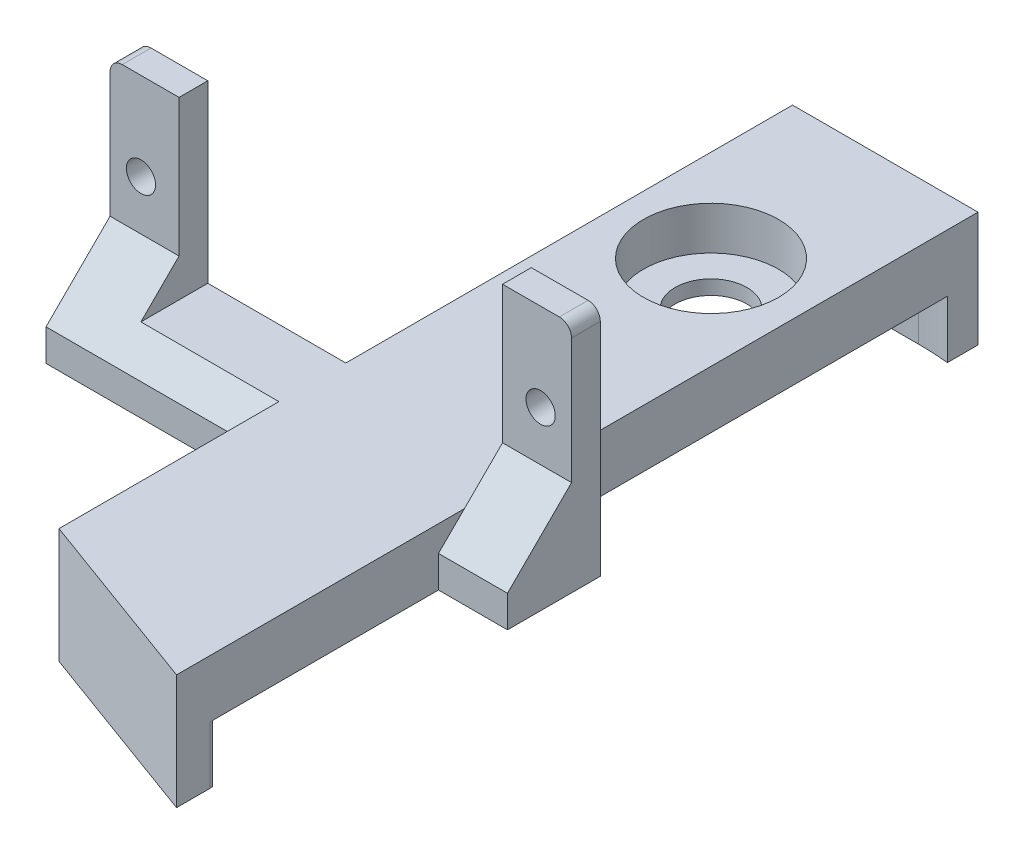
ISO-10303-21;
HEADER;
FILE_DESCRIPTION(('STEP AP214'),'2;1');
FILE_NAME('part.step','',(''),(''),'','','');
FILE_SCHEMA(('AUTOMOTIVE_DESIGN { 1 0 10303 214 1 1 1 1 }'));
ENDSEC;
DATA;
#1=APPLICATION_CONTEXT('core data for automotive mechanical design processes');
#2=APPLICATION_PROTOCOL_DEFINITION('international standard','automotive_design',2000,#1);
#3=PRODUCT_CONTEXT('',#1,'mechanical');
#4=PRODUCT('Part','Part','',(#3));
#5=PRODUCT_RELATED_PRODUCT_CATEGORY('part','',(#4));
#6=PRODUCT_DEFINITION_FORMATION('','',#4);
#7=PRODUCT_DEFINITION_CONTEXT('part definition',#1,'design');
#8=PRODUCT_DEFINITION('design','',#6,#7);
#9=PRODUCT_DEFINITION_SHAPE('','',#8);
#10=(LENGTH_UNIT() NAMED_UNIT(*) SI_UNIT(.MILLI.,.METRE.));
#11=(NAMED_UNIT(*) PLANE_ANGLE_UNIT() SI_UNIT($,.RADIAN.));
#12=(NAMED_UNIT(*) SI_UNIT($,.STERADIAN.) SOLID_ANGLE_UNIT());
#13=UNCERTAINTY_MEASURE_WITH_UNIT(LENGTH_MEASURE(1.E-05),#10,'distance_accuracy_value','');
#14=(GEOMETRIC_REPRESENTATION_CONTEXT(3) GLOBAL_UNCERTAINTY_ASSIGNED_CONTEXT((#13)) GLOBAL_UNIT_ASSIGNED_CONTEXT((#10,
#11,#12)) REPRESENTATION_CONTEXT('',''));
#15=CARTESIAN_POINT('',(0.,0.,0.));
#16=DIRECTION('',(0.,0.,1.));
#17=DIRECTION('',(1.,0.,0.));
#18=AXIS2_PLACEMENT_3D('',#15,#16,#17);
#19=CARTESIAN_POINT('',(24.0462381627888,-9.09999999999987,7.665828595555));
#20=DIRECTION('',(0.,-0.70856176119434,-0.705648801156195));
#21=DIRECTION('',(0.,0.705648801156195,-0.70856176119434));
#22=AXIS2_PLACEMENT_3D('',#19,#20,#21);
#23=PLANE('',#22);
#24=DIRECTION('',(-1.,0.,0.));
#25=VECTOR('',#24,1.);
#26=CARTESIAN_POINT('',(24.0462381627888,-7.89434521112556,6.45519679231599));
#27=LINE('',#26,#25);
#28=CARTESIAN_POINT('',(-1.64999999999999,-7.8943452111257,6.45519679231599));
#29=VERTEX_POINT('',#28);
#30=CARTESIAN_POINT('',(-16.05,-7.89434521112579,6.45519679231599));
#31=VERTEX_POINT('',#30);
#32=EDGE_CURVE('E249',#29,#31,#27,.T.);
#33=ORIENTED_EDGE('',*,*,#32,.F.);
#34=DIRECTION('',(0.,0.705648801156195,-0.70856176119434));
#35=VECTOR('',#34,1.);
#36=CARTESIAN_POINT('',(-1.65000000000002,-5.2671182257889,3.8171244584051));
#37=LINE('',#36,#35);
#38=CARTESIAN_POINT('',(-1.65000000000001,-6.10000000000001,4.65344441790159));
#39=VERTEX_POINT('',#38);
#40=EDGE_CURVE('E256',#29,#39,#37,.T.);
#41=ORIENTED_EDGE('',*,*,#40,.T.);
#42=DIRECTION('',(1.,0.,0.));
#43=VECTOR('',#42,1.);
#44=CARTESIAN_POINT('',(24.0462381627888,-6.09999999999987,4.65344441790159));
#45=LINE('',#44,#43);
#46=CARTESIAN_POINT('',(-11.25,-6.10000000000007,4.65344441790159));
#47=VERTEX_POINT('',#46);
#48=EDGE_CURVE('E435',#47,#39,#45,.T.);
#49=ORIENTED_EDGE('',*,*,#48,.F.);
#50=DIRECTION('',(0.,-0.705648801156195,0.70856176119434));
#51=VECTOR('',#50,1.);
#52=CARTESIAN_POINT('',(-11.25,-9.10000000000007,7.665828595555));
#53=LINE('',#52,#51);
#54=CARTESIAN_POINT('',(-11.25,-3.45746412666863,2.));
#55=VERTEX_POINT('',#54);
#56=EDGE_CURVE('E428',#55,#47,#53,.T.);
#57=ORIENTED_EDGE('',*,*,#56,.F.);
#58=DIRECTION('',(-1.,0.,0.));
#59=VECTOR('',#58,1.);
#60=CARTESIAN_POINT('',(24.0462381627887,-3.45746412666856,2.));
#61=LINE('',#60,#59);
#62=CARTESIAN_POINT('',(-16.05,-3.45746412666879,2.));
#63=VERTEX_POINT('',#62);
#64=EDGE_CURVE('E495',#55,#63,#61,.T.);
#65=ORIENTED_EDGE('',*,*,#64,.T.);
#66=DIRECTION('',(0.,0.705648801156195,-0.70856176119434));
#67=VECTOR('',#66,1.);
#68=CARTESIAN_POINT('',(-16.05,-9.10000000000012,7.66582859555502));
#69=LINE('',#68,#67);
#70=EDGE_CURVE('E493',#31,#63,#69,.T.);
#71=ORIENTED_EDGE('',*,*,#70,.F.);
#72=EDGE_LOOP('',(#33,#41,#49,#57,#65,#71));
#73=FACE_BOUND('',#72,.T.);
#74=ADVANCED_FACE('F37',(#73),#23,.F.);
#75=CARTESIAN_POINT('',(-16.05,0.,2.));
#76=DIRECTION('',(1.,0.,0.));
#77=DIRECTION('',(0.,1.,0.));
#78=AXIS2_PLACEMENT_3D('',#75,#76,#77);
#79=PLANE('',#78);
#80=DIRECTION('',(0.,1.,0.));
#81=VECTOR('',#80,1.);
#82=CARTESIAN_POINT('',(-16.05,-10.1000000000001,6.45519679231599));
#83=LINE('',#82,#81);
#84=CARTESIAN_POINT('',(-16.05,-10.1000000000001,6.45519679231599));
#85=VERTEX_POINT('',#84);
#86=EDGE_CURVE('E483',#85,#31,#83,.T.);
#87=ORIENTED_EDGE('',*,*,#86,.T.);
#88=ORIENTED_EDGE('',*,*,#70,.T.);
#89=DIRECTION('',(0.,-1.,0.));
#90=VECTOR('',#89,1.);
#91=CARTESIAN_POINT('',(-16.05,0.,2.));
#92=LINE('',#91,#90);
#93=CARTESIAN_POINT('',(-16.05,5.25,2.));
#94=VERTEX_POINT('',#93);
#95=EDGE_CURVE('E388',#94,#63,#92,.T.);
#96=ORIENTED_EDGE('',*,*,#95,.F.);
#97=DIRECTION('',(0.,0.,-1.));
#98=VECTOR('',#97,1.);
#99=CARTESIAN_POINT('',(-16.05,5.25,2.));
#100=LINE('',#99,#98);
#101=CARTESIAN_POINT('',(-16.05,5.25,0.));
#102=VERTEX_POINT('',#101);
#103=EDGE_CURVE('E398',#94,#102,#100,.T.);
#104=ORIENTED_EDGE('',*,*,#103,.T.);
#105=DIRECTION('',(0.,-1.,0.));
#106=VECTOR('',#105,1.);
#107=CARTESIAN_POINT('',(-16.05,0.,0.));
#108=LINE('',#107,#106);
#109=CARTESIAN_POINT('',(-16.05,-10.1000000000001,0.));
#110=VERTEX_POINT('',#109);
#111=EDGE_CURVE('E401',#102,#110,#108,.T.);
#112=ORIENTED_EDGE('',*,*,#111,.T.);
#113=DIRECTION('',(0.,0.,-1.));
#114=VECTOR('',#113,1.);
#115=CARTESIAN_POINT('',(-16.05,-10.1000000000001,6.45519679231599));
#116=LINE('',#115,#114);
#117=EDGE_CURVE('E451',#85,#110,#116,.T.);
#118=ORIENTED_EDGE('',*,*,#117,.F.);
#119=EDGE_LOOP('',(#87,#88,#96,#104,#112,#118));
#120=FACE_BOUND('',#119,.T.);
#121=ADVANCED_FACE('F582',(#120),#79,.F.);
#122=DIRECTION('',(0.,-0.705648801156195,0.70856176119434));
#123=VECTOR('',#122,1.);
#124=CARTESIAN_POINT('',(11.25,-5.26711822578882,3.8171244584051));
#125=LINE('',#124,#123);
#126=CARTESIAN_POINT('',(11.25,-6.09999999999994,4.65344441790159));
#127=VERTEX_POINT('',#126);
#128=CARTESIAN_POINT('',(11.25,-7.89434521112563,6.45519679231599));
#129=VERTEX_POINT('',#128);
#130=EDGE_CURVE('E233',#127,#129,#125,.T.);
#131=ORIENTED_EDGE('',*,*,#130,.T.);
#132=DIRECTION('',(1.,0.,0.));
#133=VECTOR('',#132,1.);
#134=CARTESIAN_POINT('',(24.0462381627888,-7.89434521112556,6.45519679231599));
#135=LINE('',#134,#133);
#136=CARTESIAN_POINT('',(16.05,-7.8943452111256,6.45519679231599));
#137=VERTEX_POINT('',#136);
#138=EDGE_CURVE('E243',#129,#137,#135,.T.);
#139=ORIENTED_EDGE('',*,*,#138,.T.);
#140=DIRECTION('',(0.,0.705648801156195,-0.70856176119434));
#141=VECTOR('',#140,1.);
#142=CARTESIAN_POINT('',(16.05,-9.09999999999991,7.665828595555));
#143=LINE('',#142,#141);
#144=CARTESIAN_POINT('',(16.05,-3.45746412666861,2.));
#145=VERTEX_POINT('',#144);
#146=EDGE_CURVE('E262',#137,#145,#143,.T.);
#147=ORIENTED_EDGE('',*,*,#146,.T.);
#148=CARTESIAN_POINT('',(11.25,-3.45746412666863,2.));
#149=VERTEX_POINT('',#148);
#150=EDGE_CURVE('E496',#145,#149,#61,.T.);
#151=ORIENTED_EDGE('',*,*,#150,.T.);
#152=DIRECTION('',(0.,0.705648801156195,-0.70856176119434));
#153=VECTOR('',#152,1.);
#154=CARTESIAN_POINT('',(11.25,-9.09999999999994,7.665828595555));
#155=LINE('',#154,#153);
#156=EDGE_CURVE('E254',#127,#149,#155,.T.);
#157=ORIENTED_EDGE('',*,*,#156,.F.);
#158=EDGE_LOOP('',(#131,#139,#147,#151,#157));
#159=FACE_BOUND('',#158,.T.);
#160=ADVANCED_FACE('F252',(#159),#23,.F.);
#161=CARTESIAN_POINT('',(0.,0.,2.));
#162=DIRECTION('',(0.,0.,1.));
#163=DIRECTION('',(1.,0.,0.));
#164=AXIS2_PLACEMENT_3D('',#161,#162,#163);
#165=PLANE('',#164);
#166=CARTESIAN_POINT('',(-13.9,0.,2.));
#167=DIRECTION('',(0.,0.,1.));
#168=DIRECTION('',(1.,0.,0.));
#169=AXIS2_PLACEMENT_3D('',#166,#167,#168);
#170=CIRCLE('',#169,1.016);
#171=CARTESIAN_POINT('',(-12.884,0.,2.));
#172=VERTEX_POINT('',#171);
#173=EDGE_CURVE('E385',#172,#172,#170,.T.);
#174=ORIENTED_EDGE('',*,*,#173,.F.);
#175=EDGE_LOOP('',(#174));
#176=FACE_BOUND('',#175,.T.);
#177=ORIENTED_EDGE('',*,*,#95,.T.);
#178=ORIENTED_EDGE('',*,*,#64,.F.);
#179=DIRECTION('',(0.,-1.,0.));
#180=VECTOR('',#179,1.);
#181=CARTESIAN_POINT('',(-11.25,0.,2.));
#182=LINE('',#181,#180);
#183=CARTESIAN_POINT('',(-11.25,6.1,2.));
#184=VERTEX_POINT('',#183);
#185=EDGE_CURVE('E392',#184,#55,#182,.T.);
#186=ORIENTED_EDGE('',*,*,#185,.F.);
#187=DIRECTION('',(-1.,0.,0.));
#188=VECTOR('',#187,1.);
#189=CARTESIAN_POINT('',(0.,6.1,2.));
#190=LINE('',#189,#188);
#191=CARTESIAN_POINT('',(-15.2,6.1,2.));
#192=VERTEX_POINT('',#191);
#193=EDGE_CURVE('E394',#184,#192,#190,.T.);
#194=ORIENTED_EDGE('',*,*,#193,.T.);
#195=CARTESIAN_POINT('',(-15.2,5.25,2.));
#196=DIRECTION('',(0.,0.,1.));
#197=DIRECTION('',(1.,0.,0.));
#198=AXIS2_PLACEMENT_3D('',#195,#196,#197);
#199=CIRCLE('',#198,0.850000000000002);
#200=EDGE_CURVE('E396',#192,#94,#199,.T.);
#201=ORIENTED_EDGE('',*,*,#200,.T.);
#202=EDGE_LOOP('',(#177,#178,#186,#194,#201));
#203=FACE_BOUND('',#202,.T.);
#204=ADVANCED_FACE('F589',(#176,#203),#165,.T.);
#205=CARTESIAN_POINT('',(0.,-9.1,2.));
#206=DIRECTION('',(0.,0.,-1.));
#207=DIRECTION('',(-1.,0.,0.));
#208=AXIS2_PLACEMENT_3D('',#205,#206,#207);
#209=PLANE('',#208);
#210=CARTESIAN_POINT('',(13.9,0.,2.));
#211=DIRECTION('',(0.,0.,1.));
#212=DIRECTION('',(1.,0.,0.));
#213=AXIS2_PLACEMENT_3D('',#210,#211,#212);
#214=CIRCLE('',#213,1.016);
#215=CARTESIAN_POINT('',(14.916,0.,2.));
#216=VERTEX_POINT('',#215);
#217=EDGE_CURVE('E313',#216,#216,#214,.T.);
#218=ORIENTED_EDGE('',*,*,#217,.F.);
#219=EDGE_LOOP('',(#218));
#220=FACE_BOUND('',#219,.T.);
#221=ORIENTED_EDGE('',*,*,#150,.F.);
#222=DIRECTION('',(0.,1.,0.));
#223=VECTOR('',#222,1.);
#224=CARTESIAN_POINT('',(16.05,-9.09999999999991,2.));
#225=LINE('',#224,#223);
#226=CARTESIAN_POINT('',(16.05,5.25,2.));
#227=VERTEX_POINT('',#226);
#228=EDGE_CURVE('E371',#145,#227,#225,.T.);
#229=ORIENTED_EDGE('',*,*,#228,.T.);
#230=CARTESIAN_POINT('',(15.2,5.25,2.));
#231=DIRECTION('',(0.,0.,1.));
#232=DIRECTION('',(1.,0.,0.));
#233=AXIS2_PLACEMENT_3D('',#230,#231,#232);
#234=CIRCLE('',#233,0.849999999999998);
#235=CARTESIAN_POINT('',(15.2,6.1,2.));
#236=VERTEX_POINT('',#235);
#237=EDGE_CURVE('E316',#227,#236,#234,.T.);
#238=ORIENTED_EDGE('',*,*,#237,.T.);
#239=DIRECTION('',(0.999998883397845,0.00149439053219066,0.));
#240=VECTOR('',#239,1.);
#241=CARTESIAN_POINT('',(-0.00908182738110785,6.07727166673534,2.));
#242=LINE('',#241,#240);
#243=CARTESIAN_POINT('',(11.25,6.09409715080671,2.));
#244=VERTEX_POINT('',#243);
#245=EDGE_CURVE('E319',#244,#236,#242,.T.);
#246=ORIENTED_EDGE('',*,*,#245,.F.);
#247=DIRECTION('',(0.,1.,0.));
#248=VECTOR('',#247,1.);
#249=CARTESIAN_POINT('',(11.25,0.,2.));
#250=LINE('',#249,#248);
#251=EDGE_CURVE('E322',#149,#244,#250,.T.);
#252=ORIENTED_EDGE('',*,*,#251,.F.);
#253=EDGE_LOOP('',(#221,#229,#238,#246,#252));
#254=FACE_BOUND('',#253,.T.);
#255=ADVANCED_FACE('F502',(#220,#254),#209,.F.);
#256=CARTESIAN_POINT('',(11.25,-9.09999999999994,0.));
#257=DIRECTION('',(-1.,0.,0.));
#258=DIRECTION('',(0.,-1.,0.));
#259=AXIS2_PLACEMENT_3D('',#256,#257,#258);
#260=PLANE('',#259);
#261=DIRECTION('',(0.,0.,1.));
#262=VECTOR('',#261,1.);
#263=CARTESIAN_POINT('',(11.25,-6.09999999999994,0.));
#264=LINE('',#263,#262);
#265=CARTESIAN_POINT('',(11.25,-6.09999999999994,24.6755929533757));
#266=VERTEX_POINT('',#265);
#267=EDGE_CURVE('E351',#127,#266,#264,.T.);
#268=ORIENTED_EDGE('',*,*,#267,.T.);
#269=DIRECTION('',(0.,1.,0.));
#270=VECTOR('',#269,1.);
#271=CARTESIAN_POINT('',(11.25,-9.09999999999994,24.6755929533757));
#272=LINE('',#271,#270);
#273=CARTESIAN_POINT('',(11.2500000000001,-14.0999999999999,24.6755929533757));
#274=VERTEX_POINT('',#273);
#275=EDGE_CURVE('E368',#274,#266,#272,.T.);
#276=ORIENTED_EDGE('',*,*,#275,.F.);
#277=DIRECTION('',(0.,0.,1.));
#278=VECTOR('',#277,1.);
#279=CARTESIAN_POINT('',(11.2500000000001,-14.0999999999999,0.));
#280=LINE('',#279,#278);
#281=CARTESIAN_POINT('',(11.2500000000001,-14.0999999999999,22.3410960151975));
#282=VERTEX_POINT('',#281);
#283=EDGE_CURVE('E296',#282,#274,#280,.T.);
#284=ORIENTED_EDGE('',*,*,#283,.F.);
#285=DIRECTION('',(0.,1.,0.));
#286=VECTOR('',#285,1.);
#287=CARTESIAN_POINT('',(11.2500000000001,-14.0999999999999,22.3410960151975));
#288=LINE('',#287,#286);
#289=CARTESIAN_POINT('',(11.25,-10.0999999999999,22.3410960151975));
#290=VERTEX_POINT('',#289);
#291=EDGE_CURVE('E305',#282,#290,#288,.T.);
#292=ORIENTED_EDGE('',*,*,#291,.T.);
#293=DIRECTION('',(0.,0.,1.));
#294=VECTOR('',#293,1.);
#295=CARTESIAN_POINT('',(11.25,-10.0999999999999,6.45519679231599));
#296=LINE('',#295,#294);
#297=CARTESIAN_POINT('',(11.25,-10.0999999999999,6.45519679231599));
#298=VERTEX_POINT('',#297);
#299=EDGE_CURVE('E236',#298,#290,#296,.T.);
#300=ORIENTED_EDGE('',*,*,#299,.F.);
#301=DIRECTION('',(0.,1.,0.));
#302=VECTOR('',#301,1.);
#303=CARTESIAN_POINT('',(11.25,-10.0999999999999,6.45519679231599));
#304=LINE('',#303,#302);
#305=EDGE_CURVE('E229',#298,#129,#304,.T.);
#306=ORIENTED_EDGE('',*,*,#305,.T.);
#307=ORIENTED_EDGE('',*,*,#130,.F.);
#308=EDGE_LOOP('',(#268,#276,#284,#292,#300,#306,#307));
#309=FACE_BOUND('',#308,.T.);
#310=ADVANCED_FACE('F231',(#309),#260,.F.);
#311=CARTESIAN_POINT('',(-1.65,-9.10000000000001,0.));
#312=DIRECTION('',(1.,0.,0.));
#313=DIRECTION('',(0.,1.,0.));
#314=AXIS2_PLACEMENT_3D('',#311,#312,#313);
#315=PLANE('',#314);
#316=ORIENTED_EDGE('',*,*,#40,.F.);
#317=DIRECTION('',(0.,1.,0.));
#318=VECTOR('',#317,1.);
#319=CARTESIAN_POINT('',(-1.65,-10.1,6.45519679231599));
#320=LINE('',#319,#318);
#321=CARTESIAN_POINT('',(-1.65,-10.1,6.45519679231599));
#322=VERTEX_POINT('',#321);
#323=EDGE_CURVE('E485',#322,#29,#320,.T.);
#324=ORIENTED_EDGE('',*,*,#323,.F.);
#325=DIRECTION('',(0.,0.,-1.));
#326=VECTOR('',#325,1.);
#327=CARTESIAN_POINT('',(-1.65,-10.1,16.4387700103624));
#328=LINE('',#327,#326);
#329=CARTESIAN_POINT('',(-1.65,-10.1,16.4387700103624));
#330=VERTEX_POINT('',#329);
#331=EDGE_CURVE('E564',#330,#322,#328,.T.);
#332=ORIENTED_EDGE('',*,*,#331,.F.);
#333=DIRECTION('',(0.,1.,0.));
#334=VECTOR('',#333,1.);
#335=CARTESIAN_POINT('',(-1.64999999999997,-14.1,16.4387700103624));
#336=LINE('',#335,#334);
#337=CARTESIAN_POINT('',(-1.64999999999997,-14.1,16.4387700103624));
#338=VERTEX_POINT('',#337);
#339=EDGE_CURVE('E52',#338,#330,#336,.T.);
#340=ORIENTED_EDGE('',*,*,#339,.F.);
#341=DIRECTION('',(0.,0.,-1.));
#342=VECTOR('',#341,1.);
#343=CARTESIAN_POINT('',(-1.64999999999997,-14.1,0.));
#344=LINE('',#343,#342);
#345=CARTESIAN_POINT('',(-1.64999999999997,-14.1,19.9527424607702));
#346=VERTEX_POINT('',#345);
#347=EDGE_CURVE('E302',#346,#338,#344,.T.);
#348=ORIENTED_EDGE('',*,*,#347,.F.);
#349=DIRECTION('',(0.,1.,0.));
#350=VECTOR('',#349,1.);
#351=CARTESIAN_POINT('',(-1.65,-9.10000000000001,19.9527424607702));
#352=LINE('',#351,#350);
#353=CARTESIAN_POINT('',(-1.65000000000002,-6.10000000000001,19.9527424607702));
#354=VERTEX_POINT('',#353);
#355=EDGE_CURVE('E366',#346,#354,#352,.T.);
#356=ORIENTED_EDGE('',*,*,#355,.T.);
#357=DIRECTION('',(0.,0.,-1.));
#358=VECTOR('',#357,1.);
#359=CARTESIAN_POINT('',(-1.65000000000002,-6.10000000000001,0.));
#360=LINE('',#359,#358);
#361=EDGE_CURVE('E356',#354,#39,#360,.T.);
#362=ORIENTED_EDGE('',*,*,#361,.T.);
#363=EDGE_LOOP('',(#316,#324,#332,#340,#348,#356,#362));
#364=FACE_BOUND('',#363,.T.);
#365=ADVANCED_FACE('F559',(#364),#315,.F.);
#366=CARTESIAN_POINT('',(0.,-6.1,0.));
#367=DIRECTION('',(0.,-1.,0.));
#368=DIRECTION('',(1.,0.,0.));
#369=AXIS2_PLACEMENT_3D('',#366,#367,#368);
#370=PLANE('',#369);
#371=DIRECTION('',(0.,0.,-1.));
#372=VECTOR('',#371,1.);
#373=CARTESIAN_POINT('',(11.25,-6.1,2.));
#374=LINE('',#373,#372);
#375=CARTESIAN_POINT('',(11.25,-6.1,0.));
#376=VERTEX_POINT('',#375);
#377=EDGE_CURVE('E324',#127,#376,#374,.T.);
#378=ORIENTED_EDGE('',*,*,#377,.T.);
#379=DIRECTION('',(0.,0.,-1.));
#380=VECTOR('',#379,1.);
#381=CARTESIAN_POINT('',(11.25,-6.09999999999994,0.));
#382=LINE('',#381,#380);
#383=CARTESIAN_POINT('',(11.25,-6.09999999999994,-31.0721362170447));
#384=VERTEX_POINT('',#383);
#385=EDGE_CURVE('E349',#376,#384,#382,.T.);
#386=ORIENTED_EDGE('',*,*,#385,.T.);
#387=DIRECTION('',(1.,0.,0.));
#388=VECTOR('',#387,1.);
#389=CARTESIAN_POINT('',(0.,-6.1,-31.0721362170447));
#390=LINE('',#389,#388);
#391=CARTESIAN_POINT('',(-1.65000000000002,-6.10000000000001,-31.0721362170447));
#392=VERTEX_POINT('',#391);
#393=EDGE_CURVE('E346',#392,#384,#390,.T.);
#394=ORIENTED_EDGE('',*,*,#393,.F.);
#395=DIRECTION('',(0.,0.,-1.));
#396=VECTOR('',#395,1.);
#397=CARTESIAN_POINT('',(-1.65000000000002,-6.10000000000001,0.));
#398=LINE('',#397,#396);
#399=CARTESIAN_POINT('',(-1.65000000000002,-6.10000000000001,0.));
#400=VERTEX_POINT('',#399);
#401=EDGE_CURVE('E344',#400,#392,#398,.T.);
#402=ORIENTED_EDGE('',*,*,#401,.F.);
#403=DIRECTION('',(-1.,0.,0.));
#404=VECTOR('',#403,1.);
#405=CARTESIAN_POINT('',(0.,-6.1,0.));
#406=LINE('',#405,#404);
#407=CARTESIAN_POINT('',(-11.25,-6.1,0.));
#408=VERTEX_POINT('',#407);
#409=EDGE_CURVE('E358',#400,#408,#406,.T.);
#410=ORIENTED_EDGE('',*,*,#409,.T.);
#411=DIRECTION('',(0.,0.,-1.));
#412=VECTOR('',#411,1.);
#413=CARTESIAN_POINT('',(-11.25,-6.1,2.));
#414=LINE('',#413,#412);
#415=EDGE_CURVE('E11',#47,#408,#414,.T.);
#416=ORIENTED_EDGE('',*,*,#415,.F.);
#417=ORIENTED_EDGE('',*,*,#48,.T.);
#418=ORIENTED_EDGE('',*,*,#361,.F.);
#419=DIRECTION('',(0.939044417262815,0.,0.343795844081251));
#420=VECTOR('',#419,1.);
#421=CARTESIAN_POINT('',(-6.63655746867287,-6.10000000000004,18.1271017322952));
#422=LINE('',#421,#420);
#423=EDGE_CURVE('E353',#354,#266,#422,.T.);
#424=ORIENTED_EDGE('',*,*,#423,.T.);
#425=ORIENTED_EDGE('',*,*,#267,.F.);
#426=EDGE_LOOP('',(#378,#386,#394,#402,#410,#416,#417,#418,#424,#425));
#427=FACE_BOUND('',#426,.T.);
#428=CARTESIAN_POINT('',(4.74999999999997,-6.09999999999998,-19.));
#429=DIRECTION('',(0.,-1.,0.));
#430=DIRECTION('',(1.,0.,0.));
#431=AXIS2_PLACEMENT_3D('',#428,#429,#430);
#432=CIRCLE('',#431,4.70000000000002);
#433=CARTESIAN_POINT('',(9.44999999999999,-6.09999999999995,-19.));
#434=VERTEX_POINT('',#433);
#435=EDGE_CURVE('E361',#434,#434,#432,.T.);
#436=ORIENTED_EDGE('',*,*,#435,.T.);
#437=EDGE_LOOP('',(#436));
#438=FACE_BOUND('',#437,.T.);
#439=ADVANCED_FACE('F432',(#427,#438),#370,.F.);
#440=CARTESIAN_POINT('',(-11.25,0.,2.));
#441=DIRECTION('',(1.,0.,0.));
#442=DIRECTION('',(0.,1.,0.));
#443=AXIS2_PLACEMENT_3D('',#440,#441,#442);
#444=PLANE('',#443);
#445=ORIENTED_EDGE('',*,*,#185,.T.);
#446=ORIENTED_EDGE('',*,*,#56,.T.);
#447=ORIENTED_EDGE('',*,*,#415,.T.);
#448=DIRECTION('',(0.,-1.,0.));
#449=VECTOR('',#448,1.);
#450=CARTESIAN_POINT('',(-11.25,0.,0.));
#451=LINE('',#450,#449);
#452=CARTESIAN_POINT('',(-11.25,6.1,0.));
#453=VERTEX_POINT('',#452);
#454=EDGE_CURVE('E403',#453,#408,#451,.T.);
#455=ORIENTED_EDGE('',*,*,#454,.F.);
#456=DIRECTION('',(0.,0.,-1.));
#457=VECTOR('',#456,1.);
#458=CARTESIAN_POINT('',(-11.25,6.1,2.));
#459=LINE('',#458,#457);
#460=EDGE_CURVE('E45',#184,#453,#459,.T.);
#461=ORIENTED_EDGE('',*,*,#460,.F.);
#462=EDGE_LOOP('',(#445,#446,#447,#455,#461));
#463=FACE_BOUND('',#462,.T.);
#464=ADVANCED_FACE('F425',(#463),#444,.T.);
#465=CARTESIAN_POINT('',(0.,6.1,2.));
#466=DIRECTION('',(0.,-1.,0.));
#467=DIRECTION('',(0.,0.,-1.));
#468=AXIS2_PLACEMENT_3D('',#465,#466,#467);
#469=PLANE('',#468);
#470=DIRECTION('',(-1.,0.,0.));
#471=VECTOR('',#470,1.);
#472=CARTESIAN_POINT('',(0.,6.1,0.));
#473=LINE('',#472,#471);
#474=CARTESIAN_POINT('',(-15.2,6.1,0.));
#475=VERTEX_POINT('',#474);
#476=EDGE_CURVE('E405',#453,#475,#473,.T.);
#477=ORIENTED_EDGE('',*,*,#476,.T.);
#478=DIRECTION('',(0.,0.,-1.));
#479=VECTOR('',#478,1.);
#480=CARTESIAN_POINT('',(-15.2,6.1,2.));
#481=LINE('',#480,#479);
#482=EDGE_CURVE('E410',#192,#475,#481,.T.);
#483=ORIENTED_EDGE('',*,*,#482,.F.);
#484=ORIENTED_EDGE('',*,*,#193,.F.);
#485=ORIENTED_EDGE('',*,*,#460,.T.);
#486=EDGE_LOOP('',(#477,#483,#484,#485));
#487=FACE_BOUND('',#486,.T.);
#488=ADVANCED_FACE('F415',(#487),#469,.F.);
#489=CARTESIAN_POINT('',(-13.9,0.,2.));
#490=DIRECTION('',(0.,0.,-1.));
#491=DIRECTION('',(-1.,0.,0.));
#492=AXIS2_PLACEMENT_3D('',#489,#490,#491);
#493=CYLINDRICAL_SURFACE('',#492,1.016);
#494=ORIENTED_EDGE('',*,*,#173,.T.);
#495=EDGE_LOOP('',(#494));
#496=FACE_BOUND('',#495,.T.);
#497=CARTESIAN_POINT('',(-13.9,0.,0.));
#498=DIRECTION('',(0.,0.,1.));
#499=DIRECTION('',(1.,0.,0.));
#500=AXIS2_PLACEMENT_3D('',#497,#498,#499);
#501=CIRCLE('',#500,1.016);
#502=CARTESIAN_POINT('',(-12.884,0.,0.));
#503=VERTEX_POINT('',#502);
#504=EDGE_CURVE('E384',#503,#503,#501,.T.);
#505=ORIENTED_EDGE('',*,*,#504,.F.);
#506=EDGE_LOOP('',(#505));
#507=FACE_BOUND('',#506,.T.);
#508=ADVANCED_FACE('F39',(#496,#507),#493,.F.);
#509=CARTESIAN_POINT('',(-15.2,5.25,2.));
#510=DIRECTION('',(0.,0.,-1.));
#511=DIRECTION('',(-1.,0.,0.));
#512=AXIS2_PLACEMENT_3D('',#509,#510,#511);
#513=CYLINDRICAL_SURFACE('',#512,0.850000000000002);
#514=CARTESIAN_POINT('',(-15.2,5.25,0.));
#515=DIRECTION('',(0.,0.,1.));
#516=DIRECTION('',(1.,0.,0.));
#517=AXIS2_PLACEMENT_3D('',#514,#515,#516);
#518=CIRCLE('',#517,0.850000000000002);
#519=EDGE_CURVE('E389',#475,#102,#518,.T.);
#520=ORIENTED_EDGE('',*,*,#519,.T.);
#521=ORIENTED_EDGE('',*,*,#103,.F.);
#522=ORIENTED_EDGE('',*,*,#200,.F.);
#523=ORIENTED_EDGE('',*,*,#482,.T.);
#524=EDGE_LOOP('',(#520,#521,#522,#523));
#525=FACE_BOUND('',#524,.T.);
#526=ADVANCED_FACE('F587',(#525),#513,.T.);
#527=CARTESIAN_POINT('',(0.,0.,0.));
#528=DIRECTION('',(0.,0.,1.));
#529=DIRECTION('',(1.,0.,0.));
#530=AXIS2_PLACEMENT_3D('',#527,#528,#529);
#531=PLANE('',#530);
#532=ORIENTED_EDGE('',*,*,#504,.T.);
#533=EDGE_LOOP('',(#532));
#534=FACE_BOUND('',#533,.T.);
#535=ORIENTED_EDGE('',*,*,#111,.F.);
#536=ORIENTED_EDGE('',*,*,#519,.F.);
#537=ORIENTED_EDGE('',*,*,#476,.F.);
#538=ORIENTED_EDGE('',*,*,#454,.T.);
#539=ORIENTED_EDGE('',*,*,#409,.F.);
#540=DIRECTION('',(0.,1.,0.));
#541=VECTOR('',#540,1.);
#542=CARTESIAN_POINT('',(-1.65,-9.10000000000001,0.));
#543=LINE('',#542,#541);
#544=CARTESIAN_POINT('',(-1.65,-10.1,0.));
#545=VERTEX_POINT('',#544);
#546=EDGE_CURVE('E364',#545,#400,#543,.T.);
#547=ORIENTED_EDGE('',*,*,#546,.F.);
#548=DIRECTION('',(1.,0.,0.));
#549=VECTOR('',#548,1.);
#550=CARTESIAN_POINT('',(-16.05,-10.1000000000001,0.));
#551=LINE('',#550,#549);
#552=EDGE_CURVE('E440',#110,#545,#551,.T.);
#553=ORIENTED_EDGE('',*,*,#552,.F.);
#554=EDGE_LOOP('',(#535,#536,#537,#538,#539,#547,#553));
#555=FACE_BOUND('',#554,.T.);
#556=ADVANCED_FACE('F423',(#534,#555),#531,.F.);
#557=CARTESIAN_POINT('',(-1.65,-9.10000000000001,0.));
#558=DIRECTION('',(1.,0.,0.));
#559=DIRECTION('',(0.,1.,0.));
#560=AXIS2_PLACEMENT_3D('',#557,#558,#559);
#561=PLANE('',#560);
#562=ORIENTED_EDGE('',*,*,#401,.T.);
#563=DIRECTION('',(0.,1.,0.));
#564=VECTOR('',#563,1.);
#565=CARTESIAN_POINT('',(-1.65,-9.10000000000001,-31.0721362170447));
#566=LINE('',#565,#564);
#567=CARTESIAN_POINT('',(-1.64999999999997,-14.1,-31.0721362170447));
#568=VERTEX_POINT('',#567);
#569=EDGE_CURVE('E381',#568,#392,#566,.T.);
#570=ORIENTED_EDGE('',*,*,#569,.F.);
#571=DIRECTION('',(0.,0.,-1.));
#572=VECTOR('',#571,1.);
#573=CARTESIAN_POINT('',(-1.64999999999997,-14.1,0.));
#574=LINE('',#573,#572);
#575=CARTESIAN_POINT('',(-1.64999999999997,-14.1,-26.7487095699865));
#576=VERTEX_POINT('',#575);
#577=EDGE_CURVE('E259',#576,#568,#574,.T.);
#578=ORIENTED_EDGE('',*,*,#577,.F.);
#579=DIRECTION('',(0.,1.,0.));
#580=VECTOR('',#579,1.);
#581=CARTESIAN_POINT('',(-1.64999999999997,-14.1,-26.7487095699865));
#582=LINE('',#581,#580);
#583=CARTESIAN_POINT('',(-1.65,-10.1,-26.7487095699865));
#584=VERTEX_POINT('',#583);
#585=EDGE_CURVE('E287',#576,#584,#582,.T.);
#586=ORIENTED_EDGE('',*,*,#585,.T.);
#587=DIRECTION('',(0.,0.,-1.));
#588=VECTOR('',#587,1.);
#589=CARTESIAN_POINT('',(-1.65,-10.1,0.));
#590=LINE('',#589,#588);
#591=EDGE_CURVE('E449',#545,#584,#590,.T.);
#592=ORIENTED_EDGE('',*,*,#591,.F.);
#593=ORIENTED_EDGE('',*,*,#546,.T.);
#594=EDGE_LOOP('',(#562,#570,#578,#586,#592,#593));
#595=FACE_BOUND('',#594,.T.);
#596=ADVANCED_FACE('F453',(#595),#561,.F.);
#597=CARTESIAN_POINT('',(0.,-9.1,-31.0721362170447));
#598=DIRECTION('',(0.,0.,1.));
#599=DIRECTION('',(1.,0.,0.));
#600=AXIS2_PLACEMENT_3D('',#597,#598,#599);
#601=PLANE('',#600);
#602=ORIENTED_EDGE('',*,*,#393,.T.);
#603=DIRECTION('',(0.,1.,0.));
#604=VECTOR('',#603,1.);
#605=CARTESIAN_POINT('',(11.25,-9.09999999999994,-31.0721362170447));
#606=LINE('',#605,#604);
#607=CARTESIAN_POINT('',(11.2500000000001,-14.0999999999999,-31.0721362170447));
#608=VERTEX_POINT('',#607);
#609=EDGE_CURVE('E378',#608,#384,#606,.T.);
#610=ORIENTED_EDGE('',*,*,#609,.F.);
#611=DIRECTION('',(1.,0.,0.));
#612=VECTOR('',#611,1.);
#613=CARTESIAN_POINT('',(0.,-14.1,-31.0721362170447));
#614=LINE('',#613,#612);
#615=EDGE_CURVE('E268',#568,#608,#614,.T.);
#616=ORIENTED_EDGE('',*,*,#615,.F.);
#617=ORIENTED_EDGE('',*,*,#569,.T.);
#618=EDGE_LOOP('',(#602,#610,#616,#617));
#619=FACE_BOUND('',#618,.T.);
#620=ADVANCED_FACE('F529',(#619),#601,.F.);
#621=CARTESIAN_POINT('',(11.25,-9.09999999999994,0.));
#622=DIRECTION('',(1.,0.,0.));
#623=DIRECTION('',(0.,1.,0.));
#624=AXIS2_PLACEMENT_3D('',#621,#622,#623);
#625=PLANE('',#624);
#626=DIRECTION('',(0.,1.,0.));
#627=VECTOR('',#626,1.);
#628=CARTESIAN_POINT('',(11.25,-9.09999999999994,0.));
#629=LINE('',#628,#627);
#630=CARTESIAN_POINT('',(11.25,-10.0999999999999,0.));
#631=VERTEX_POINT('',#630);
#632=EDGE_CURVE('E375',#631,#376,#629,.T.);
#633=ORIENTED_EDGE('',*,*,#632,.F.);
#634=DIRECTION('',(0.,0.,1.));
#635=VECTOR('',#634,1.);
#636=CARTESIAN_POINT('',(11.25,-10.0999999999999,-28.9397191588193));
#637=LINE('',#636,#635);
#638=CARTESIAN_POINT('',(11.25,-10.0999999999999,-28.9397191588193));
#639=VERTEX_POINT('',#638);
#640=EDGE_CURVE('E466',#639,#631,#637,.T.);
#641=ORIENTED_EDGE('',*,*,#640,.F.);
#642=DIRECTION('',(0.,1.,0.));
#643=VECTOR('',#642,1.);
#644=CARTESIAN_POINT('',(11.2500000000001,-14.0999999999999,-28.9397191588193));
#645=LINE('',#644,#643);
#646=CARTESIAN_POINT('',(11.2500000000001,-14.0999999999999,-28.9397191588193));
#647=VERTEX_POINT('',#646);
#648=EDGE_CURVE('E285',#647,#639,#645,.T.);
#649=ORIENTED_EDGE('',*,*,#648,.F.);
#650=DIRECTION('',(0.,0.,-1.));
#651=VECTOR('',#650,1.);
#652=CARTESIAN_POINT('',(11.2500000000001,-14.0999999999999,0.));
#653=LINE('',#652,#651);
#654=EDGE_CURVE('E271',#647,#608,#653,.T.);
#655=ORIENTED_EDGE('',*,*,#654,.T.);
#656=ORIENTED_EDGE('',*,*,#609,.T.);
#657=ORIENTED_EDGE('',*,*,#385,.F.);
#658=EDGE_LOOP('',(#633,#641,#649,#655,#656,#657));
#659=FACE_BOUND('',#658,.T.);
#660=ADVANCED_FACE('F525',(#659),#625,.T.);
#661=CARTESIAN_POINT('',(0.,-9.1,0.));
#662=DIRECTION('',(0.,0.,1.));
#663=DIRECTION('',(1.,0.,0.));
#664=AXIS2_PLACEMENT_3D('',#661,#662,#663);
#665=PLANE('',#664);
#666=ORIENTED_EDGE('',*,*,#632,.T.);
#667=DIRECTION('',(0.,1.,0.));
#668=VECTOR('',#667,1.);
#669=CARTESIAN_POINT('',(11.25,0.,0.));
#670=LINE('',#669,#668);
#671=CARTESIAN_POINT('',(11.25,6.09409715080671,0.));
#672=VERTEX_POINT('',#671);
#673=EDGE_CURVE('E317',#376,#672,#670,.T.);
#674=ORIENTED_EDGE('',*,*,#673,.T.);
#675=DIRECTION('',(0.999998883397845,0.00149439053219066,0.));
#676=VECTOR('',#675,1.);
#677=CARTESIAN_POINT('',(-0.00908182738110785,6.07727166673534,0.));
#678=LINE('',#677,#676);
#679=CARTESIAN_POINT('',(15.2,6.1,0.));
#680=VERTEX_POINT('',#679);
#681=EDGE_CURVE('E330',#672,#680,#678,.T.);
#682=ORIENTED_EDGE('',*,*,#681,.T.);
#683=CARTESIAN_POINT('',(15.2,5.25,0.));
#684=DIRECTION('',(0.,0.,1.));
#685=DIRECTION('',(1.,0.,0.));
#686=AXIS2_PLACEMENT_3D('',#683,#684,#685);
#687=CIRCLE('',#686,0.849999999999998);
#688=CARTESIAN_POINT('',(16.05,5.25,0.));
#689=VERTEX_POINT('',#688);
#690=EDGE_CURVE('E327',#689,#680,#687,.T.);
#691=ORIENTED_EDGE('',*,*,#690,.F.);
#692=DIRECTION('',(0.,1.,0.));
#693=VECTOR('',#692,1.);
#694=CARTESIAN_POINT('',(16.05,-9.09999999999991,0.));
#695=LINE('',#694,#693);
#696=CARTESIAN_POINT('',(16.05,-10.0999999999999,0.));
#697=VERTEX_POINT('',#696);
#698=EDGE_CURVE('E373',#697,#689,#695,.T.);
#699=ORIENTED_EDGE('',*,*,#698,.F.);
#700=DIRECTION('',(1.,0.,0.));
#701=VECTOR('',#700,1.);
#702=CARTESIAN_POINT('',(11.25,-10.0999999999999,0.));
#703=LINE('',#702,#701);
#704=EDGE_CURVE('E469',#631,#697,#703,.T.);
#705=ORIENTED_EDGE('',*,*,#704,.F.);
#706=EDGE_LOOP('',(#666,#674,#682,#691,#699,#705));
#707=FACE_BOUND('',#706,.T.);
#708=CARTESIAN_POINT('',(13.9,0.,0.));
#709=DIRECTION('',(0.,0.,1.));
#710=DIRECTION('',(1.,0.,0.));
#711=AXIS2_PLACEMENT_3D('',#708,#709,#710);
#712=CIRCLE('',#711,1.016);
#713=CARTESIAN_POINT('',(14.916,0.,0.));
#714=VERTEX_POINT('',#713);
#715=EDGE_CURVE('E312',#714,#714,#712,.T.);
#716=ORIENTED_EDGE('',*,*,#715,.T.);
#717=EDGE_LOOP('',(#716));
#718=FACE_BOUND('',#717,.T.);
#719=ADVANCED_FACE('F521',(#707,#718),#665,.F.);
#720=CARTESIAN_POINT('',(16.05,-9.09999999999991,0.));
#721=DIRECTION('',(-1.,0.,0.));
#722=DIRECTION('',(0.,-1.,0.));
#723=AXIS2_PLACEMENT_3D('',#720,#721,#722);
#724=PLANE('',#723);
#725=ORIENTED_EDGE('',*,*,#146,.F.);
#726=DIRECTION('',(0.,1.,0.));
#727=VECTOR('',#726,1.);
#728=CARTESIAN_POINT('',(16.05,-10.0999999999999,6.45519679231599));
#729=LINE('',#728,#727);
#730=CARTESIAN_POINT('',(16.05,-10.0999999999999,6.45519679231599));
#731=VERTEX_POINT('',#730);
#732=EDGE_CURVE('E239',#731,#137,#729,.T.);
#733=ORIENTED_EDGE('',*,*,#732,.F.);
#734=DIRECTION('',(0.,0.,1.));
#735=VECTOR('',#734,1.);
#736=CARTESIAN_POINT('',(16.05,-10.0999999999999,0.));
#737=LINE('',#736,#735);
#738=EDGE_CURVE('E472',#697,#731,#737,.T.);
#739=ORIENTED_EDGE('',*,*,#738,.F.);
#740=ORIENTED_EDGE('',*,*,#698,.T.);
#741=DIRECTION('',(0.,0.,-1.));
#742=VECTOR('',#741,1.);
#743=CARTESIAN_POINT('',(16.05,5.25,2.));
#744=LINE('',#743,#742);
#745=EDGE_CURVE('E341',#227,#689,#744,.T.);
#746=ORIENTED_EDGE('',*,*,#745,.F.);
#747=ORIENTED_EDGE('',*,*,#228,.F.);
#748=EDGE_LOOP('',(#725,#733,#739,#740,#746,#747));
#749=FACE_BOUND('',#748,.T.);
#750=ADVANCED_FACE('F505',(#749),#724,.F.);
#751=CARTESIAN_POINT('',(-6.63655746867285,-9.10000000000004,18.1271017322952));
#752=DIRECTION('',(-0.343795844081251,0.,0.939044417262815));
#753=DIRECTION('',(0.939044417262815,0.,0.343795844081251));
#754=AXIS2_PLACEMENT_3D('',#751,#752,#753);
#755=PLANE('',#754);
#756=ORIENTED_EDGE('',*,*,#423,.F.);
#757=ORIENTED_EDGE('',*,*,#355,.F.);
#758=DIRECTION('',(0.939044417262815,0.,0.343795844081251));
#759=VECTOR('',#758,1.);
#760=CARTESIAN_POINT('',(-6.63655746867283,-14.1,18.1271017322952));
#761=LINE('',#760,#759);
#762=EDGE_CURVE('E299',#346,#274,#761,.T.);
#763=ORIENTED_EDGE('',*,*,#762,.T.);
#764=ORIENTED_EDGE('',*,*,#275,.T.);
#765=EDGE_LOOP('',(#756,#757,#763,#764));
#766=FACE_BOUND('',#765,.T.);
#767=ADVANCED_FACE('F555',(#766),#755,.T.);
#768=CARTESIAN_POINT('',(4.74999999999998,-9.09999999999998,-19.));
#769=DIRECTION('',(0.,1.,0.));
#770=DIRECTION('',(-1.,0.,0.));
#771=AXIS2_PLACEMENT_3D('',#768,#769,#770);
#772=CYLINDRICAL_SURFACE('',#771,4.70000000000002);
#773=CARTESIAN_POINT('',(4.74999999999998,-9.09999999999998,-19.));
#774=DIRECTION('',(0.,-1.,0.));
#775=DIRECTION('',(1.,0.,0.));
#776=AXIS2_PLACEMENT_3D('',#773,#774,#775);
#777=CIRCLE('',#776,4.70000000000002);
#778=CARTESIAN_POINT('',(9.45,-9.09999999999995,-19.));
#779=VERTEX_POINT('',#778);
#780=EDGE_CURVE('E487',#779,#779,#777,.T.);
#781=ORIENTED_EDGE('',*,*,#780,.T.);
#782=EDGE_LOOP('',(#781));
#783=FACE_BOUND('',#782,.T.);
#784=ORIENTED_EDGE('',*,*,#435,.F.);
#785=EDGE_LOOP('',(#784));
#786=FACE_BOUND('',#785,.T.);
#787=ADVANCED_FACE('F636',(#783,#786),#772,.F.);
#788=CARTESIAN_POINT('',(15.2,5.25,2.));
#789=DIRECTION('',(0.,0.,-1.));
#790=DIRECTION('',(-1.,0.,0.));
#791=AXIS2_PLACEMENT_3D('',#788,#789,#790);
#792=CYLINDRICAL_SURFACE('',#791,0.849999999999998);
#793=ORIENTED_EDGE('',*,*,#690,.T.);
#794=DIRECTION('',(0.,0.,-1.));
#795=VECTOR('',#794,1.);
#796=CARTESIAN_POINT('',(15.2,6.1,2.));
#797=LINE('',#796,#795);
#798=EDGE_CURVE('E339',#236,#680,#797,.T.);
#799=ORIENTED_EDGE('',*,*,#798,.F.);
#800=ORIENTED_EDGE('',*,*,#237,.F.);
#801=ORIENTED_EDGE('',*,*,#745,.T.);
#802=EDGE_LOOP('',(#793,#799,#800,#801));
#803=FACE_BOUND('',#802,.T.);
#804=ADVANCED_FACE('F511',(#803),#792,.T.);
#805=CARTESIAN_POINT('',(-0.00908182738110785,6.07727166673534,2.));
#806=DIRECTION('',(-0.00149439053219066,0.999998883397845,0.));
#807=DIRECTION('',(-0.999998883397845,-0.00149439053219066,0.));
#808=AXIS2_PLACEMENT_3D('',#805,#806,#807);
#809=PLANE('',#808);
#810=ORIENTED_EDGE('',*,*,#681,.F.);
#811=DIRECTION('',(0.,0.,-1.));
#812=VECTOR('',#811,1.);
#813=CARTESIAN_POINT('',(11.25,6.09409715080671,2.));
#814=LINE('',#813,#812);
#815=EDGE_CURVE('E336',#244,#672,#814,.T.);
#816=ORIENTED_EDGE('',*,*,#815,.F.);
#817=ORIENTED_EDGE('',*,*,#245,.T.);
#818=ORIENTED_EDGE('',*,*,#798,.T.);
#819=EDGE_LOOP('',(#810,#816,#817,#818));
#820=FACE_BOUND('',#819,.T.);
#821=ADVANCED_FACE('F515',(#820),#809,.T.);
#822=CARTESIAN_POINT('',(11.25,0.,2.));
#823=DIRECTION('',(-1.,0.,0.));
#824=DIRECTION('',(0.,-1.,0.));
#825=AXIS2_PLACEMENT_3D('',#822,#823,#824);
#826=PLANE('',#825);
#827=ORIENTED_EDGE('',*,*,#815,.T.);
#828=ORIENTED_EDGE('',*,*,#673,.F.);
#829=ORIENTED_EDGE('',*,*,#377,.F.);
#830=ORIENTED_EDGE('',*,*,#156,.T.);
#831=ORIENTED_EDGE('',*,*,#251,.T.);
#832=EDGE_LOOP('',(#827,#828,#829,#830,#831));
#833=FACE_BOUND('',#832,.T.);
#834=ADVANCED_FACE('F517',(#833),#826,.T.);
#835=CARTESIAN_POINT('',(13.9,0.,2.));
#836=DIRECTION('',(0.,0.,-1.));
#837=DIRECTION('',(-1.,0.,0.));
#838=AXIS2_PLACEMENT_3D('',#835,#836,#837);
#839=CYLINDRICAL_SURFACE('',#838,1.016);
#840=ORIENTED_EDGE('',*,*,#217,.T.);
#841=EDGE_LOOP('',(#840));
#842=FACE_BOUND('',#841,.T.);
#843=ORIENTED_EDGE('',*,*,#715,.F.);
#844=EDGE_LOOP('',(#843));
#845=FACE_BOUND('',#844,.T.);
#846=ADVANCED_FACE('F634',(#842,#845),#839,.F.);
#847=CARTESIAN_POINT('',(4.75000000000001,-14.1,8.69006044037595));
#848=DIRECTION('',(0.,1.,0.));
#849=DIRECTION('',(-1.,0.,0.));
#850=AXIS2_PLACEMENT_3D('',#847,#848,#849);
#851=CYLINDRICAL_SURFACE('',#850,10.05);
#852=CARTESIAN_POINT('',(4.74999999999999,-10.1,8.69006044037595));
#853=DIRECTION('',(0.,-1.,0.));
#854=DIRECTION('',(1.,0.,0.));
#855=AXIS2_PLACEMENT_3D('',#852,#853,#854);
#856=CIRCLE('',#855,10.05);
#857=CARTESIAN_POINT('',(0.976831020057116,-10.1,18.0048710046761));
#858=VERTEX_POINT('',#857);
#859=EDGE_CURVE('E57',#858,#330,#856,.T.);
#860=ORIENTED_EDGE('',*,*,#859,.F.);
#861=DIRECTION('',(0.,1.,0.));
#862=VECTOR('',#861,1.);
#863=CARTESIAN_POINT('',(0.976831020057139,-14.1,18.0048710046761));
#864=LINE('',#863,#862);
#865=CARTESIAN_POINT('',(0.976831020057139,-14.1,18.0048710046761));
#866=VERTEX_POINT('',#865);
#867=EDGE_CURVE('E310',#866,#858,#864,.T.);
#868=ORIENTED_EDGE('',*,*,#867,.F.);
#869=CARTESIAN_POINT('',(4.75000000000001,-14.1,8.69006044037595));
#870=DIRECTION('',(0.,-1.,0.));
#871=DIRECTION('',(1.,0.,0.));
#872=AXIS2_PLACEMENT_3D('',#869,#870,#871);
#873=CIRCLE('',#872,10.05);
#874=EDGE_CURVE('E290',#866,#338,#873,.T.);
#875=ORIENTED_EDGE('',*,*,#874,.T.);
#876=ORIENTED_EDGE('',*,*,#339,.T.);
#877=EDGE_LOOP('',(#860,#868,#875,#876));
#878=FACE_BOUND('',#877,.T.);
#879=ADVANCED_FACE('F561',(#878),#851,.F.);
#880=CARTESIAN_POINT('',(-6.12755746728395,-14.1,15.1270821246063));
#881=DIRECTION('',(-0.375439699496806,0.,0.926846822318418));
#882=DIRECTION('',(0.926846822318418,0.,0.375439699496806));
#883=AXIS2_PLACEMENT_3D('',#880,#881,#882);
#884=PLANE('',#883);
#885=ORIENTED_EDGE('',*,*,#867,.T.);
#886=DIRECTION('',(-0.926846822318418,0.,-0.375439699496806));
#887=VECTOR('',#886,1.);
#888=CARTESIAN_POINT('',(11.2312280150252,-10.0999999999999,22.1586401427971));
#889=LINE('',#888,#887);
#890=CARTESIAN_POINT('',(11.2312280150252,-10.1,22.1586401427971));
#891=VERTEX_POINT('',#890);
#892=EDGE_CURVE('E240',#891,#858,#889,.T.);
#893=ORIENTED_EDGE('',*,*,#892,.F.);
#894=DIRECTION('',(0.,1.,0.));
#895=VECTOR('',#894,1.);
#896=CARTESIAN_POINT('',(11.2312280150252,-14.0999999999999,22.1586401427971));
#897=LINE('',#896,#895);
#898=CARTESIAN_POINT('',(11.2312280150252,-14.0999999999999,22.1586401427971));
#899=VERTEX_POINT('',#898);
#900=EDGE_CURVE('E307',#899,#891,#897,.T.);
#901=ORIENTED_EDGE('',*,*,#900,.F.);
#902=DIRECTION('',(0.926846822318418,0.,0.375439699496806));
#903=VECTOR('',#902,1.);
#904=CARTESIAN_POINT('',(-6.12755746728395,-14.1,15.1270821246063));
#905=LINE('',#904,#903);
#906=EDGE_CURVE('E292',#866,#899,#905,.T.);
#907=ORIENTED_EDGE('',*,*,#906,.F.);
#908=EDGE_LOOP('',(#885,#893,#901,#907));
#909=FACE_BOUND('',#908,.T.);
#910=ADVANCED_FACE('F563',(#909),#884,.F.);
#911=CARTESIAN_POINT('',(8.85767334001579,-14.1,-0.91132233050784));
#912=DIRECTION('',(-0.994748982577914,0.,0.102344817456499));
#913=DIRECTION('',(0.102344817456499,0.,0.994748982577915));
#914=AXIS2_PLACEMENT_3D('',#911,#912,#913);
#915=PLANE('',#914);
#916=ORIENTED_EDGE('',*,*,#900,.T.);
#917=DIRECTION('',(-0.102344817456505,0.,-0.994748982577914));
#918=VECTOR('',#917,1.);
#919=CARTESIAN_POINT('',(11.25,-10.0999999999999,22.3410960151975));
#920=LINE('',#919,#918);
#921=EDGE_CURVE('E477',#290,#891,#920,.T.);
#922=ORIENTED_EDGE('',*,*,#921,.F.);
#923=ORIENTED_EDGE('',*,*,#291,.F.);
#924=DIRECTION('',(0.102344817456499,0.,0.994748982577914));
#925=VECTOR('',#924,1.);
#926=CARTESIAN_POINT('',(8.85767334001579,-14.1,-0.91132233050784));
#927=LINE('',#926,#925);
#928=EDGE_CURVE('E294',#899,#282,#927,.T.);
#929=ORIENTED_EDGE('',*,*,#928,.F.);
#930=EDGE_LOOP('',(#916,#922,#923,#929));
#931=FACE_BOUND('',#930,.T.);
#932=ADVANCED_FACE('F545',(#931),#915,.F.);
#933=CARTESIAN_POINT('',(0.,-14.1,0.));
#934=DIRECTION('',(0.,-1.,0.));
#935=DIRECTION('',(1.,0.,0.));
#936=AXIS2_PLACEMENT_3D('',#933,#934,#935);
#937=PLANE('',#936);
#938=ORIENTED_EDGE('',*,*,#874,.F.);
#939=ORIENTED_EDGE('',*,*,#906,.T.);
#940=ORIENTED_EDGE('',*,*,#928,.T.);
#941=ORIENTED_EDGE('',*,*,#283,.T.);
#942=ORIENTED_EDGE('',*,*,#762,.F.);
#943=ORIENTED_EDGE('',*,*,#347,.T.);
#944=EDGE_LOOP('',(#938,#939,#940,#941,#942,#943));
#945=FACE_BOUND('',#944,.T.);
#946=ADVANCED_FACE('F552',(#945),#937,.T.);
#947=CARTESIAN_POINT('',(4.75000000000003,-14.1,-19.));
#948=DIRECTION('',(0.,1.,0.));
#949=DIRECTION('',(-1.,0.,0.));
#950=AXIS2_PLACEMENT_3D('',#947,#948,#949);
#951=CYLINDRICAL_SURFACE('',#950,10.05);
#952=CARTESIAN_POINT('',(4.75000000000001,-10.1,-19.));
#953=DIRECTION('',(0.,-1.,0.));
#954=DIRECTION('',(1.,0.,0.));
#955=AXIS2_PLACEMENT_3D('',#952,#953,#954);
#956=CIRCLE('',#955,10.05);
#957=CARTESIAN_POINT('',(4.74999999999999,-10.1,-29.05));
#958=VERTEX_POINT('',#957);
#959=EDGE_CURVE('E455',#584,#958,#956,.T.);
#960=ORIENTED_EDGE('',*,*,#959,.F.);
#961=ORIENTED_EDGE('',*,*,#585,.F.);
#962=CARTESIAN_POINT('',(4.75000000000003,-14.1,-19.));
#963=DIRECTION('',(0.,-1.,0.));
#964=DIRECTION('',(1.,0.,0.));
#965=AXIS2_PLACEMENT_3D('',#962,#963,#964);
#966=CIRCLE('',#965,10.05);
#967=CARTESIAN_POINT('',(4.75000000000001,-14.1,-29.05));
#968=VERTEX_POINT('',#967);
#969=EDGE_CURVE('E255',#576,#968,#966,.T.);
#970=ORIENTED_EDGE('',*,*,#969,.T.);
#971=DIRECTION('',(0.,1.,0.));
#972=VECTOR('',#971,1.);
#973=CARTESIAN_POINT('',(4.75000000000001,-14.1,-29.05));
#974=LINE('',#973,#972);
#975=EDGE_CURVE('E279',#968,#958,#974,.T.);
#976=ORIENTED_EDGE('',*,*,#975,.T.);
#977=EDGE_LOOP('',(#960,#961,#970,#976));
#978=FACE_BOUND('',#977,.T.);
#979=ADVANCED_FACE('F537',(#978),#951,.F.);
#980=CARTESIAN_POINT('',(9.14997622217938,-14.1,-8.99999999999998));
#981=DIRECTION('',(0.,1.,0.));
#982=DIRECTION('',(-1.,0.,0.));
#983=AXIS2_PLACEMENT_3D('',#980,#981,#982);
#984=CYLINDRICAL_SURFACE('',#983,20.05);
#985=CARTESIAN_POINT('',(9.14997622217936,-10.1,-8.99999999999998));
#986=DIRECTION('',(0.,-1.,0.));
#987=DIRECTION('',(1.,0.,0.));
#988=AXIS2_PLACEMENT_3D('',#985,#986,#987);
#989=CIRCLE('',#988,20.05);
#990=CARTESIAN_POINT('',(9.14997622217936,-10.0999999999999,-29.05));
#991=VERTEX_POINT('',#990);
#992=EDGE_CURVE('E463',#991,#639,#989,.T.);
#993=ORIENTED_EDGE('',*,*,#992,.F.);
#994=DIRECTION('',(0.,1.,0.));
#995=VECTOR('',#994,1.);
#996=CARTESIAN_POINT('',(9.14997622217938,-14.1,-29.05));
#997=LINE('',#996,#995);
#998=CARTESIAN_POINT('',(9.14997622217938,-14.1,-29.05));
#999=VERTEX_POINT('',#998);
#1000=EDGE_CURVE('E282',#999,#991,#997,.T.);
#1001=ORIENTED_EDGE('',*,*,#1000,.F.);
#1002=CARTESIAN_POINT('',(9.14997622217938,-14.1,-8.99999999999998));
#1003=DIRECTION('',(0.,-1.,0.));
#1004=DIRECTION('',(1.,0.,0.));
#1005=AXIS2_PLACEMENT_3D('',#1002,#1003,#1004);
#1006=CIRCLE('',#1005,20.05);
#1007=EDGE_CURVE('E274',#999,#647,#1006,.T.);
#1008=ORIENTED_EDGE('',*,*,#1007,.T.);
#1009=ORIENTED_EDGE('',*,*,#648,.T.);
#1010=EDGE_LOOP('',(#993,#1001,#1008,#1009));
#1011=FACE_BOUND('',#1010,.T.);
#1012=ADVANCED_FACE('F541',(#1011),#984,.F.);
#1013=CARTESIAN_POINT('',(0.,-14.1,-29.05));
#1014=DIRECTION('',(0.,0.,-1.));
#1015=DIRECTION('',(-1.,0.,0.));
#1016=AXIS2_PLACEMENT_3D('',#1013,#1014,#1015);
#1017=PLANE('',#1016);
#1018=ORIENTED_EDGE('',*,*,#1000,.T.);
#1019=DIRECTION('',(1.,0.,0.));
#1020=VECTOR('',#1019,1.);
#1021=CARTESIAN_POINT('',(4.74999999999999,-10.1,-29.05));
#1022=LINE('',#1021,#1020);
#1023=EDGE_CURVE('E457',#958,#991,#1022,.T.);
#1024=ORIENTED_EDGE('',*,*,#1023,.F.);
#1025=ORIENTED_EDGE('',*,*,#975,.F.);
#1026=DIRECTION('',(-1.,0.,0.));
#1027=VECTOR('',#1026,1.);
#1028=CARTESIAN_POINT('',(0.,-14.1,-29.05));
#1029=LINE('',#1028,#1027);
#1030=EDGE_CURVE('E277',#999,#968,#1029,.T.);
#1031=ORIENTED_EDGE('',*,*,#1030,.F.);
#1032=EDGE_LOOP('',(#1018,#1024,#1025,#1031));
#1033=FACE_BOUND('',#1032,.T.);
#1034=ADVANCED_FACE('F539',(#1033),#1017,.F.);
#1035=CARTESIAN_POINT('',(0.,-14.1,0.));
#1036=DIRECTION('',(0.,-1.,0.));
#1037=DIRECTION('',(1.,0.,0.));
#1038=AXIS2_PLACEMENT_3D('',#1035,#1036,#1037);
#1039=PLANE('',#1038);
#1040=ORIENTED_EDGE('',*,*,#969,.F.);
#1041=ORIENTED_EDGE('',*,*,#577,.T.);
#1042=ORIENTED_EDGE('',*,*,#615,.T.);
#1043=ORIENTED_EDGE('',*,*,#654,.F.);
#1044=ORIENTED_EDGE('',*,*,#1007,.F.);
#1045=ORIENTED_EDGE('',*,*,#1030,.T.);
#1046=EDGE_LOOP('',(#1040,#1041,#1042,#1043,#1044,#1045));
#1047=FACE_BOUND('',#1046,.T.);
#1048=ADVANCED_FACE('F532',(#1047),#1039,.T.);
#1049=CARTESIAN_POINT('',(4.74999999999999,-10.1,8.69006044037595));
#1050=DIRECTION('',(0.,-1.,0.));
#1051=DIRECTION('',(1.,0.,0.));
#1052=AXIS2_PLACEMENT_3D('',#1049,#1050,#1051);
#1053=PLANE('',#1052);
#1054=ORIENTED_EDGE('',*,*,#859,.T.);
#1055=ORIENTED_EDGE('',*,*,#331,.T.);
#1056=DIRECTION('',(-1.,0.,0.));
#1057=VECTOR('',#1056,1.);
#1058=CARTESIAN_POINT('',(-1.65,-10.1,6.45519679231599));
#1059=LINE('',#1058,#1057);
#1060=EDGE_CURVE('E568',#322,#85,#1059,.T.);
#1061=ORIENTED_EDGE('',*,*,#1060,.T.);
#1062=ORIENTED_EDGE('',*,*,#117,.T.);
#1063=ORIENTED_EDGE('',*,*,#552,.T.);
#1064=ORIENTED_EDGE('',*,*,#591,.T.);
#1065=ORIENTED_EDGE('',*,*,#959,.T.);
#1066=ORIENTED_EDGE('',*,*,#1023,.T.);
#1067=ORIENTED_EDGE('',*,*,#992,.T.);
#1068=ORIENTED_EDGE('',*,*,#640,.T.);
#1069=ORIENTED_EDGE('',*,*,#704,.T.);
#1070=ORIENTED_EDGE('',*,*,#738,.T.);
#1071=DIRECTION('',(-1.,0.,0.));
#1072=VECTOR('',#1071,1.);
#1073=CARTESIAN_POINT('',(16.05,-10.0999999999999,6.45519679231599));
#1074=LINE('',#1073,#1072);
#1075=EDGE_CURVE('E474',#731,#298,#1074,.T.);
#1076=ORIENTED_EDGE('',*,*,#1075,.T.);
#1077=ORIENTED_EDGE('',*,*,#299,.T.);
#1078=ORIENTED_EDGE('',*,*,#921,.T.);
#1079=ORIENTED_EDGE('',*,*,#892,.T.);
#1080=EDGE_LOOP('',(#1054,#1055,#1061,#1062,#1063,#1064,#1065,#1066,#1067,#1068,#1069,#1070,
#1076,#1077,#1078,#1079));
#1081=FACE_BOUND('',#1080,.T.);
#1082=CARTESIAN_POINT('',(4.75000000000001,-10.1,-19.));
#1083=DIRECTION('',(0.,-1.,0.));
#1084=DIRECTION('',(1.,0.,0.));
#1085=AXIS2_PLACEMENT_3D('',#1082,#1083,#1084);
#1086=CIRCLE('',#1085,2.5);
#1087=CARTESIAN_POINT('',(7.25000000000001,-10.1,-19.));
#1088=VERTEX_POINT('',#1087);
#1089=EDGE_CURVE('E566',#1088,#1088,#1086,.T.);
#1090=ORIENTED_EDGE('',*,*,#1089,.F.);
#1091=EDGE_LOOP('',(#1090));
#1092=FACE_BOUND('',#1091,.T.);
#1093=ADVANCED_FACE('F446',(#1081,#1092),#1053,.T.);
#1094=CARTESIAN_POINT('',(4.74999999999998,-9.09999999999998,8.69006044037595));
#1095=DIRECTION('',(0.,-1.,0.));
#1096=DIRECTION('',(1.,0.,0.));
#1097=AXIS2_PLACEMENT_3D('',#1094,#1095,#1096);
#1098=PLANE('',#1097);
#1099=ORIENTED_EDGE('',*,*,#780,.F.);
#1100=EDGE_LOOP('',(#1099));
#1101=FACE_BOUND('',#1100,.T.);
#1102=CARTESIAN_POINT('',(4.75000000000001,-9.09999999999998,-19.));
#1103=DIRECTION('',(0.,-1.,0.));
#1104=DIRECTION('',(1.,0.,0.));
#1105=AXIS2_PLACEMENT_3D('',#1102,#1103,#1104);
#1106=CIRCLE('',#1105,2.5);
#1107=CARTESIAN_POINT('',(7.25,-9.09999999999996,-19.));
#1108=VERTEX_POINT('',#1107);
#1109=EDGE_CURVE('E248',#1108,#1108,#1106,.T.);
#1110=ORIENTED_EDGE('',*,*,#1109,.T.);
#1111=EDGE_LOOP('',(#1110));
#1112=FACE_BOUND('',#1111,.T.);
#1113=ADVANCED_FACE('F779',(#1101,#1112),#1098,.F.);
#1114=CARTESIAN_POINT('',(-1.65,-10.1,6.45519679231599));
#1115=DIRECTION('',(0.,0.,-1.));
#1116=DIRECTION('',(-1.,0.,0.));
#1117=AXIS2_PLACEMENT_3D('',#1114,#1115,#1116);
#1118=PLANE('',#1117);
#1119=ORIENTED_EDGE('',*,*,#323,.T.);
#1120=ORIENTED_EDGE('',*,*,#32,.T.);
#1121=ORIENTED_EDGE('',*,*,#86,.F.);
#1122=ORIENTED_EDGE('',*,*,#1060,.F.);
#1123=EDGE_LOOP('',(#1119,#1120,#1121,#1122));
#1124=FACE_BOUND('',#1123,.T.);
#1125=ADVANCED_FACE('F578',(#1124),#1118,.F.);
#1126=CARTESIAN_POINT('',(16.05,-10.0999999999999,6.45519679231599));
#1127=DIRECTION('',(0.,0.,-1.));
#1128=DIRECTION('',(-1.,0.,0.));
#1129=AXIS2_PLACEMENT_3D('',#1126,#1127,#1128);
#1130=PLANE('',#1129);
#1131=ORIENTED_EDGE('',*,*,#732,.T.);
#1132=ORIENTED_EDGE('',*,*,#138,.F.);
#1133=ORIENTED_EDGE('',*,*,#305,.F.);
#1134=ORIENTED_EDGE('',*,*,#1075,.F.);
#1135=EDGE_LOOP('',(#1131,#1132,#1133,#1134));
#1136=FACE_BOUND('',#1135,.T.);
#1137=ADVANCED_FACE('F244',(#1136),#1130,.F.);
#1138=CARTESIAN_POINT('',(4.75000000000001,-10.1,-19.));
#1139=DIRECTION('',(0.,1.,0.));
#1140=DIRECTION('',(-1.,0.,0.));
#1141=AXIS2_PLACEMENT_3D('',#1138,#1139,#1140);
#1142=CYLINDRICAL_SURFACE('',#1141,2.5);
#1143=ORIENTED_EDGE('',*,*,#1089,.T.);
#1144=EDGE_LOOP('',(#1143));
#1145=FACE_BOUND('',#1144,.T.);
#1146=ORIENTED_EDGE('',*,*,#1109,.F.);
#1147=EDGE_LOOP('',(#1146));
#1148=FACE_BOUND('',#1147,.T.);
#1149=ADVANCED_FACE('F806',(#1145,#1148),#1142,.F.);
#1150=CLOSED_SHELL('',(#74,#121,#160,#204,#255,#310,#365,#439,#464,#488,#508,#526,#556,#596,
#620,#660,#719,#750,#767,#787,#804,#821,#834,#846,#879,#910,#932,#946,#979,#1012,#1034,#1048,
#1093,#1113,#1125,#1137,#1149));
#1151=MANIFOLD_SOLID_BREP('B2',#1150);
#1152=ADVANCED_BREP_SHAPE_REPRESENTATION('',(#18,#1151),#14);
#1153=SHAPE_DEFINITION_REPRESENTATION(#9,#1152);
ENDSEC;
END-ISO-10303-21;
